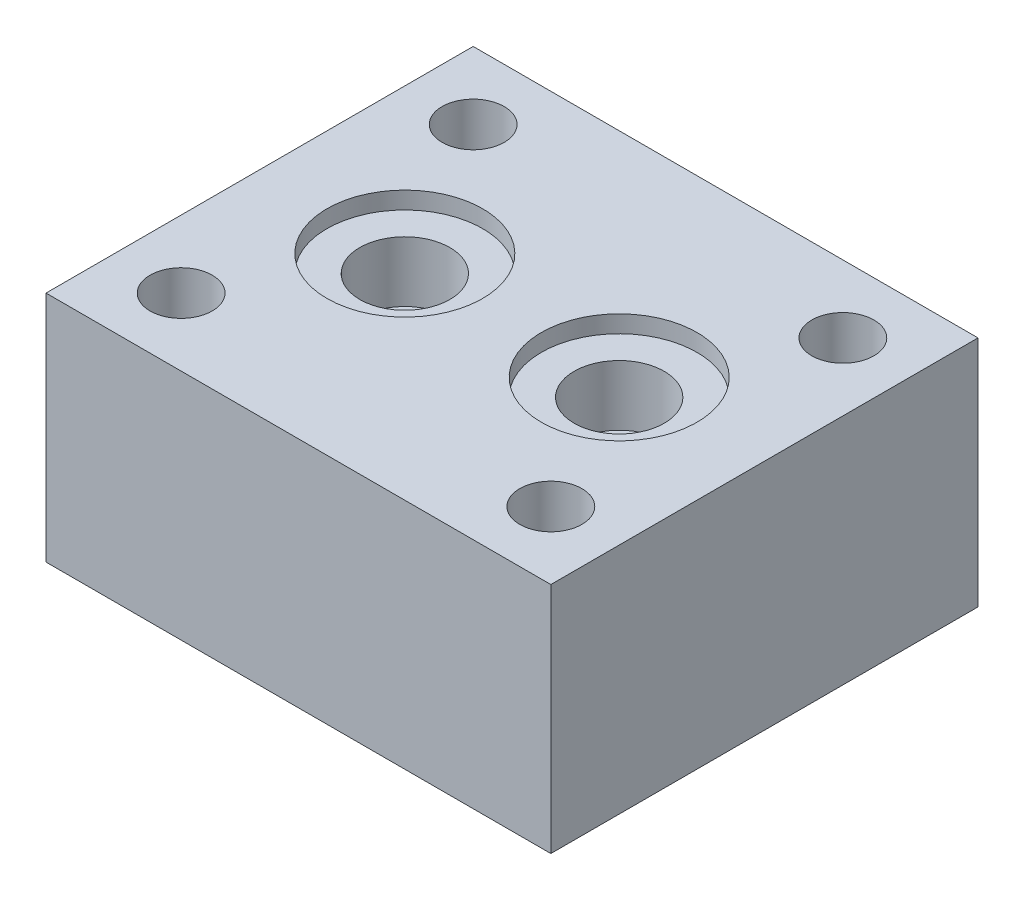
ISO-10303-21;
HEADER;
FILE_DESCRIPTION(('STEP AP214'),'2;1');
FILE_NAME('part.step','',(''),(''),'','','');
FILE_SCHEMA(('AUTOMOTIVE_DESIGN { 1 0 10303 214 1 1 1 1 }'));
ENDSEC;
DATA;
#1=APPLICATION_CONTEXT('core data for automotive mechanical design processes');
#2=APPLICATION_PROTOCOL_DEFINITION('international standard','automotive_design',2000,#1);
#3=PRODUCT_CONTEXT('',#1,'mechanical');
#4=PRODUCT('Part','Part','',(#3));
#5=PRODUCT_RELATED_PRODUCT_CATEGORY('part','',(#4));
#6=PRODUCT_DEFINITION_FORMATION('','',#4);
#7=PRODUCT_DEFINITION_CONTEXT('part definition',#1,'design');
#8=PRODUCT_DEFINITION('design','',#6,#7);
#9=PRODUCT_DEFINITION_SHAPE('','',#8);
#10=(LENGTH_UNIT() NAMED_UNIT(*) SI_UNIT(.MILLI.,.METRE.));
#11=(NAMED_UNIT(*) PLANE_ANGLE_UNIT() SI_UNIT($,.RADIAN.));
#12=(NAMED_UNIT(*) SI_UNIT($,.STERADIAN.) SOLID_ANGLE_UNIT());
#13=UNCERTAINTY_MEASURE_WITH_UNIT(LENGTH_MEASURE(1.E-05),#10,'distance_accuracy_value','');
#14=(GEOMETRIC_REPRESENTATION_CONTEXT(3) GLOBAL_UNCERTAINTY_ASSIGNED_CONTEXT((#13)) GLOBAL_UNIT_ASSIGNED_CONTEXT((#10,
#11,#12)) REPRESENTATION_CONTEXT('',''));
#15=CARTESIAN_POINT('',(0.,0.,0.));
#16=DIRECTION('',(0.,0.,1.));
#17=DIRECTION('',(1.,0.,0.));
#18=AXIS2_PLACEMENT_3D('',#15,#16,#17);
#19=CARTESIAN_POINT('',(41.275,19.05,34.925));
#20=DIRECTION('',(-1.,0.,0.));
#21=DIRECTION('',(0.,0.,1.));
#22=AXIS2_PLACEMENT_3D('',#19,#20,#21);
#23=PLANE('',#22);
#24=DIRECTION('',(0.,0.,-1.));
#25=VECTOR('',#24,1.);
#26=CARTESIAN_POINT('',(41.275,-19.05,34.925));
#27=LINE('',#26,#25);
#28=CARTESIAN_POINT('',(41.275,-19.05,34.925));
#29=VERTEX_POINT('',#28);
#30=CARTESIAN_POINT('',(41.275,-19.05,-34.925));
#31=VERTEX_POINT('',#30);
#32=EDGE_CURVE('E109',#29,#31,#27,.T.);
#33=ORIENTED_EDGE('',*,*,#32,.T.);
#34=DIRECTION('',(0.,-1.,0.));
#35=VECTOR('',#34,1.);
#36=CARTESIAN_POINT('',(41.275,19.05,-34.925));
#37=LINE('',#36,#35);
#38=CARTESIAN_POINT('',(41.275,19.05,-34.925));
#39=VERTEX_POINT('',#38);
#40=EDGE_CURVE('E11',#39,#31,#37,.T.);
#41=ORIENTED_EDGE('',*,*,#40,.F.);
#42=DIRECTION('',(0.,0.,-1.));
#43=VECTOR('',#42,1.);
#44=CARTESIAN_POINT('',(41.275,19.05,34.925));
#45=LINE('',#44,#43);
#46=CARTESIAN_POINT('',(41.275,19.05,34.925));
#47=VERTEX_POINT('',#46);
#48=EDGE_CURVE('E96',#47,#39,#45,.T.);
#49=ORIENTED_EDGE('',*,*,#48,.F.);
#50=DIRECTION('',(0.,-1.,0.));
#51=VECTOR('',#50,1.);
#52=CARTESIAN_POINT('',(41.275,19.05,34.925));
#53=LINE('',#52,#51);
#54=EDGE_CURVE('E105',#47,#29,#53,.T.);
#55=ORIENTED_EDGE('',*,*,#54,.T.);
#56=EDGE_LOOP('',(#33,#41,#49,#55));
#57=FACE_BOUND('',#56,.T.);
#58=ADVANCED_FACE('F43',(#57),#23,.F.);
#59=CARTESIAN_POINT('',(-41.275,19.05,-34.925));
#60=DIRECTION('',(0.,0.,1.));
#61=DIRECTION('',(1.,0.,0.));
#62=AXIS2_PLACEMENT_3D('',#59,#60,#61);
#63=PLANE('',#62);
#64=DIRECTION('',(-1.,0.,0.));
#65=VECTOR('',#64,1.);
#66=CARTESIAN_POINT('',(-41.275,-19.05,-34.925));
#67=LINE('',#66,#65);
#68=CARTESIAN_POINT('',(-41.275,-19.05,-34.925));
#69=VERTEX_POINT('',#68);
#70=EDGE_CURVE('E100',#31,#69,#67,.T.);
#71=ORIENTED_EDGE('',*,*,#70,.T.);
#72=DIRECTION('',(0.,-1.,0.));
#73=VECTOR('',#72,1.);
#74=CARTESIAN_POINT('',(-41.275,19.05,-34.925));
#75=LINE('',#74,#73);
#76=CARTESIAN_POINT('',(-41.275,19.05,-34.925));
#77=VERTEX_POINT('',#76);
#78=EDGE_CURVE('E52',#77,#69,#75,.T.);
#79=ORIENTED_EDGE('',*,*,#78,.F.);
#80=DIRECTION('',(-1.,0.,0.));
#81=VECTOR('',#80,1.);
#82=CARTESIAN_POINT('',(-41.275,19.05,-34.925));
#83=LINE('',#82,#81);
#84=EDGE_CURVE('E91',#39,#77,#83,.T.);
#85=ORIENTED_EDGE('',*,*,#84,.F.);
#86=ORIENTED_EDGE('',*,*,#40,.T.);
#87=EDGE_LOOP('',(#71,#79,#85,#86));
#88=FACE_BOUND('',#87,.T.);
#89=ADVANCED_FACE('F99',(#88),#63,.F.);
#90=CARTESIAN_POINT('',(-41.275,19.05,34.925));
#91=DIRECTION('',(1.,0.,0.));
#92=DIRECTION('',(0.,0.,-1.));
#93=AXIS2_PLACEMENT_3D('',#90,#91,#92);
#94=PLANE('',#93);
#95=DIRECTION('',(0.,0.,1.));
#96=VECTOR('',#95,1.);
#97=CARTESIAN_POINT('',(-41.275,-19.05,34.925));
#98=LINE('',#97,#96);
#99=CARTESIAN_POINT('',(-41.275,-19.05,34.925));
#100=VERTEX_POINT('',#99);
#101=EDGE_CURVE('E78',#69,#100,#98,.T.);
#102=ORIENTED_EDGE('',*,*,#101,.T.);
#103=DIRECTION('',(0.,-1.,0.));
#104=VECTOR('',#103,1.);
#105=CARTESIAN_POINT('',(-41.275,19.05,34.925));
#106=LINE('',#105,#104);
#107=CARTESIAN_POINT('',(-41.275,19.05,34.925));
#108=VERTEX_POINT('',#107);
#109=EDGE_CURVE('E101',#108,#100,#106,.T.);
#110=ORIENTED_EDGE('',*,*,#109,.F.);
#111=DIRECTION('',(0.,0.,1.));
#112=VECTOR('',#111,1.);
#113=CARTESIAN_POINT('',(-41.275,19.05,34.925));
#114=LINE('',#113,#112);
#115=EDGE_CURVE('E94',#77,#108,#114,.T.);
#116=ORIENTED_EDGE('',*,*,#115,.F.);
#117=ORIENTED_EDGE('',*,*,#78,.T.);
#118=EDGE_LOOP('',(#102,#110,#116,#117));
#119=FACE_BOUND('',#118,.T.);
#120=ADVANCED_FACE('F103',(#119),#94,.F.);
#121=CARTESIAN_POINT('',(-41.275,19.05,34.925));
#122=DIRECTION('',(0.,0.,-1.));
#123=DIRECTION('',(-1.,0.,0.));
#124=AXIS2_PLACEMENT_3D('',#121,#122,#123);
#125=PLANE('',#124);
#126=DIRECTION('',(1.,0.,0.));
#127=VECTOR('',#126,1.);
#128=CARTESIAN_POINT('',(-41.275,-19.05,34.925));
#129=LINE('',#128,#127);
#130=EDGE_CURVE('E84',#100,#29,#129,.T.);
#131=ORIENTED_EDGE('',*,*,#130,.T.);
#132=ORIENTED_EDGE('',*,*,#54,.F.);
#133=DIRECTION('',(1.,0.,0.));
#134=VECTOR('',#133,1.);
#135=CARTESIAN_POINT('',(-41.275,19.05,34.925));
#136=LINE('',#135,#134);
#137=EDGE_CURVE('E61',#108,#47,#136,.T.);
#138=ORIENTED_EDGE('',*,*,#137,.F.);
#139=ORIENTED_EDGE('',*,*,#109,.T.);
#140=EDGE_LOOP('',(#131,#132,#138,#139));
#141=FACE_BOUND('',#140,.T.);
#142=ADVANCED_FACE('F171',(#141),#125,.F.);
#143=CARTESIAN_POINT('',(0.,19.05,0.));
#144=DIRECTION('',(0.,-1.,0.));
#145=DIRECTION('',(0.,0.,-1.));
#146=AXIS2_PLACEMENT_3D('',#143,#144,#145);
#147=PLANE('',#146);
#148=CARTESIAN_POINT('',(-17.526,19.05,0.));
#149=DIRECTION('',(0.,1.,0.));
#150=DIRECTION('',(0.,0.,1.));
#151=AXIS2_PLACEMENT_3D('',#148,#149,#150);
#152=CIRCLE('',#151,12.7254);
#153=CARTESIAN_POINT('',(-17.526,19.05,12.7254));
#154=VERTEX_POINT('',#153);
#155=EDGE_CURVE('E125',#154,#154,#152,.T.);
#156=ORIENTED_EDGE('',*,*,#155,.F.);
#157=EDGE_LOOP('',(#156));
#158=FACE_BOUND('',#157,.T.);
#159=CARTESIAN_POINT('',(17.526,19.05,0.));
#160=DIRECTION('',(0.,1.,0.));
#161=DIRECTION('',(0.,0.,1.));
#162=AXIS2_PLACEMENT_3D('',#159,#160,#161);
#163=CIRCLE('',#162,12.7254);
#164=CARTESIAN_POINT('',(17.526,19.05,12.7254));
#165=VERTEX_POINT('',#164);
#166=EDGE_CURVE('E130',#165,#165,#163,.T.);
#167=ORIENTED_EDGE('',*,*,#166,.F.);
#168=EDGE_LOOP('',(#167));
#169=FACE_BOUND('',#168,.T.);
#170=CARTESIAN_POINT('',(30.226,19.05,23.876));
#171=DIRECTION('',(0.,1.,0.));
#172=DIRECTION('',(0.,0.,1.));
#173=AXIS2_PLACEMENT_3D('',#170,#171,#172);
#174=CIRCLE('',#173,5.08);
#175=CARTESIAN_POINT('',(30.226,19.05,28.956));
#176=VERTEX_POINT('',#175);
#177=EDGE_CURVE('E150',#176,#176,#174,.T.);
#178=ORIENTED_EDGE('',*,*,#177,.F.);
#179=EDGE_LOOP('',(#178));
#180=FACE_BOUND('',#179,.T.);
#181=CARTESIAN_POINT('',(-30.226,19.05,-23.876));
#182=DIRECTION('',(0.,1.,0.));
#183=DIRECTION('',(0.,0.,1.));
#184=AXIS2_PLACEMENT_3D('',#181,#182,#183);
#185=CIRCLE('',#184,5.08);
#186=CARTESIAN_POINT('',(-30.226,19.05,-18.796));
#187=VERTEX_POINT('',#186);
#188=EDGE_CURVE('E157',#187,#187,#185,.T.);
#189=ORIENTED_EDGE('',*,*,#188,.F.);
#190=EDGE_LOOP('',(#189));
#191=FACE_BOUND('',#190,.T.);
#192=CARTESIAN_POINT('',(30.226,19.05,-23.876));
#193=DIRECTION('',(0.,1.,0.));
#194=DIRECTION('',(0.,0.,1.));
#195=AXIS2_PLACEMENT_3D('',#192,#193,#194);
#196=CIRCLE('',#195,5.08);
#197=CARTESIAN_POINT('',(30.226,19.05,-18.796));
#198=VERTEX_POINT('',#197);
#199=EDGE_CURVE('E144',#198,#198,#196,.T.);
#200=ORIENTED_EDGE('',*,*,#199,.F.);
#201=EDGE_LOOP('',(#200));
#202=FACE_BOUND('',#201,.T.);
#203=CARTESIAN_POINT('',(-30.226,19.05,23.876));
#204=DIRECTION('',(0.,1.,0.));
#205=DIRECTION('',(0.,0.,1.));
#206=AXIS2_PLACEMENT_3D('',#203,#204,#205);
#207=CIRCLE('',#206,5.08);
#208=CARTESIAN_POINT('',(-30.226,19.05,28.956));
#209=VERTEX_POINT('',#208);
#210=EDGE_CURVE('E153',#209,#209,#207,.T.);
#211=ORIENTED_EDGE('',*,*,#210,.F.);
#212=EDGE_LOOP('',(#211));
#213=FACE_BOUND('',#212,.T.);
#214=ORIENTED_EDGE('',*,*,#48,.T.);
#215=ORIENTED_EDGE('',*,*,#84,.T.);
#216=ORIENTED_EDGE('',*,*,#115,.T.);
#217=ORIENTED_EDGE('',*,*,#137,.T.);
#218=EDGE_LOOP('',(#214,#215,#216,#217));
#219=FACE_BOUND('',#218,.T.);
#220=ADVANCED_FACE('F92',(#158,#169,#180,#191,#202,#213,#219),#147,.F.);
#221=CARTESIAN_POINT('',(0.,-19.05,0.));
#222=DIRECTION('',(0.,-1.,0.));
#223=DIRECTION('',(0.,0.,-1.));
#224=AXIS2_PLACEMENT_3D('',#221,#222,#223);
#225=PLANE('',#224);
#226=CARTESIAN_POINT('',(30.226,-19.05,23.876));
#227=DIRECTION('',(0.,1.,0.));
#228=DIRECTION('',(0.,0.,1.));
#229=AXIS2_PLACEMENT_3D('',#226,#227,#228);
#230=CIRCLE('',#229,5.08);
#231=CARTESIAN_POINT('',(30.226,-19.05,28.956));
#232=VERTEX_POINT('',#231);
#233=EDGE_CURVE('E154',#232,#232,#230,.T.);
#234=ORIENTED_EDGE('',*,*,#233,.T.);
#235=EDGE_LOOP('',(#234));
#236=FACE_BOUND('',#235,.T.);
#237=CARTESIAN_POINT('',(-30.226,-19.05,-23.876));
#238=DIRECTION('',(0.,1.,0.));
#239=DIRECTION('',(0.,0.,1.));
#240=AXIS2_PLACEMENT_3D('',#237,#238,#239);
#241=CIRCLE('',#240,5.08);
#242=CARTESIAN_POINT('',(-30.226,-19.05,-18.796));
#243=VERTEX_POINT('',#242);
#244=EDGE_CURVE('E147',#243,#243,#241,.T.);
#245=ORIENTED_EDGE('',*,*,#244,.T.);
#246=EDGE_LOOP('',(#245));
#247=FACE_BOUND('',#246,.T.);
#248=CARTESIAN_POINT('',(30.226,-19.05,-23.876));
#249=DIRECTION('',(0.,1.,0.));
#250=DIRECTION('',(0.,0.,1.));
#251=AXIS2_PLACEMENT_3D('',#248,#249,#250);
#252=CIRCLE('',#251,5.08);
#253=CARTESIAN_POINT('',(30.226,-19.05,-18.796));
#254=VERTEX_POINT('',#253);
#255=EDGE_CURVE('E141',#254,#254,#252,.T.);
#256=ORIENTED_EDGE('',*,*,#255,.T.);
#257=EDGE_LOOP('',(#256));
#258=FACE_BOUND('',#257,.T.);
#259=CARTESIAN_POINT('',(-30.226,-19.05,23.876));
#260=DIRECTION('',(0.,1.,0.));
#261=DIRECTION('',(0.,0.,1.));
#262=AXIS2_PLACEMENT_3D('',#259,#260,#261);
#263=CIRCLE('',#262,5.08);
#264=CARTESIAN_POINT('',(-30.226,-19.05,28.956));
#265=VERTEX_POINT('',#264);
#266=EDGE_CURVE('E112',#265,#265,#263,.T.);
#267=ORIENTED_EDGE('',*,*,#266,.T.);
#268=EDGE_LOOP('',(#267));
#269=FACE_BOUND('',#268,.T.);
#270=ORIENTED_EDGE('',*,*,#32,.F.);
#271=ORIENTED_EDGE('',*,*,#130,.F.);
#272=ORIENTED_EDGE('',*,*,#101,.F.);
#273=ORIENTED_EDGE('',*,*,#70,.F.);
#274=EDGE_LOOP('',(#270,#271,#272,#273));
#275=FACE_BOUND('',#274,.T.);
#276=ADVANCED_FACE('F170',(#236,#247,#258,#269,#275),#225,.T.);
#277=CARTESIAN_POINT('',(-30.226,-19.05,23.876));
#278=DIRECTION('',(0.,1.,0.));
#279=DIRECTION('',(0.,0.,1.));
#280=AXIS2_PLACEMENT_3D('',#277,#278,#279);
#281=CYLINDRICAL_SURFACE('',#280,5.08);
#282=ORIENTED_EDGE('',*,*,#266,.F.);
#283=EDGE_LOOP('',(#282));
#284=FACE_BOUND('',#283,.T.);
#285=ORIENTED_EDGE('',*,*,#210,.T.);
#286=EDGE_LOOP('',(#285));
#287=FACE_BOUND('',#286,.T.);
#288=ADVANCED_FACE('F167',(#284,#287),#281,.F.);
#289=CARTESIAN_POINT('',(30.226,-19.05,-23.876));
#290=DIRECTION('',(0.,1.,0.));
#291=DIRECTION('',(0.,0.,1.));
#292=AXIS2_PLACEMENT_3D('',#289,#290,#291);
#293=CYLINDRICAL_SURFACE('',#292,5.08);
#294=ORIENTED_EDGE('',*,*,#255,.F.);
#295=EDGE_LOOP('',(#294));
#296=FACE_BOUND('',#295,.T.);
#297=ORIENTED_EDGE('',*,*,#199,.T.);
#298=EDGE_LOOP('',(#297));
#299=FACE_BOUND('',#298,.T.);
#300=ADVANCED_FACE('F216',(#296,#299),#293,.F.);
#301=CARTESIAN_POINT('',(-30.226,-19.05,-23.876));
#302=DIRECTION('',(0.,1.,0.));
#303=DIRECTION('',(0.,0.,1.));
#304=AXIS2_PLACEMENT_3D('',#301,#302,#303);
#305=CYLINDRICAL_SURFACE('',#304,5.08);
#306=ORIENTED_EDGE('',*,*,#244,.F.);
#307=EDGE_LOOP('',(#306));
#308=FACE_BOUND('',#307,.T.);
#309=ORIENTED_EDGE('',*,*,#188,.T.);
#310=EDGE_LOOP('',(#309));
#311=FACE_BOUND('',#310,.T.);
#312=ADVANCED_FACE('F224',(#308,#311),#305,.F.);
#313=CARTESIAN_POINT('',(30.226,-19.05,23.876));
#314=DIRECTION('',(0.,1.,0.));
#315=DIRECTION('',(0.,0.,1.));
#316=AXIS2_PLACEMENT_3D('',#313,#314,#315);
#317=CYLINDRICAL_SURFACE('',#316,5.08);
#318=ORIENTED_EDGE('',*,*,#233,.F.);
#319=EDGE_LOOP('',(#318));
#320=FACE_BOUND('',#319,.T.);
#321=ORIENTED_EDGE('',*,*,#177,.T.);
#322=EDGE_LOOP('',(#321));
#323=FACE_BOUND('',#322,.T.);
#324=ADVANCED_FACE('F233',(#320,#323),#317,.F.);
#325=CARTESIAN_POINT('',(-17.526,16.2306,0.));
#326=DIRECTION('',(0.,1.,0.));
#327=DIRECTION('',(0.,0.,1.));
#328=AXIS2_PLACEMENT_3D('',#325,#326,#327);
#329=PLANE('',#328);
#330=CARTESIAN_POINT('',(-17.526,16.2306,0.));
#331=DIRECTION('',(0.,1.,0.));
#332=DIRECTION('',(0.,0.,1.));
#333=AXIS2_PLACEMENT_3D('',#330,#331,#332);
#334=CIRCLE('',#333,12.7254);
#335=CARTESIAN_POINT('',(-17.526,16.2306,12.7254));
#336=VERTEX_POINT('',#335);
#337=EDGE_CURVE('E119',#336,#336,#334,.T.);
#338=ORIENTED_EDGE('',*,*,#337,.T.);
#339=EDGE_LOOP('',(#338));
#340=FACE_BOUND('',#339,.T.);
#341=CARTESIAN_POINT('',(-17.526,16.2306,0.));
#342=DIRECTION('',(0.,1.,0.));
#343=DIRECTION('',(0.,0.,1.));
#344=AXIS2_PLACEMENT_3D('',#341,#342,#343);
#345=CIRCLE('',#344,7.366);
#346=CARTESIAN_POINT('',(-17.526,16.2306,7.366));
#347=VERTEX_POINT('',#346);
#348=EDGE_CURVE('E117',#347,#347,#345,.F.);
#349=ORIENTED_EDGE('',*,*,#348,.T.);
#350=EDGE_LOOP('',(#349));
#351=FACE_BOUND('',#350,.T.);
#352=ADVANCED_FACE('F242',(#340,#351),#329,.T.);
#353=CARTESIAN_POINT('',(-17.526,16.2306,0.));
#354=DIRECTION('',(0.,1.,0.));
#355=DIRECTION('',(0.,0.,1.));
#356=AXIS2_PLACEMENT_3D('',#353,#354,#355);
#357=CYLINDRICAL_SURFACE('',#356,12.7254);
#358=ORIENTED_EDGE('',*,*,#337,.F.);
#359=EDGE_LOOP('',(#358));
#360=FACE_BOUND('',#359,.T.);
#361=ORIENTED_EDGE('',*,*,#155,.T.);
#362=EDGE_LOOP('',(#361));
#363=FACE_BOUND('',#362,.T.);
#364=ADVANCED_FACE('F289',(#360,#363),#357,.F.);
#365=CARTESIAN_POINT('',(17.526,16.2306,0.));
#366=DIRECTION('',(0.,1.,0.));
#367=DIRECTION('',(0.,0.,1.));
#368=AXIS2_PLACEMENT_3D('',#365,#366,#367);
#369=PLANE('',#368);
#370=CARTESIAN_POINT('',(17.526,16.2306,0.));
#371=DIRECTION('',(0.,1.,0.));
#372=DIRECTION('',(0.,0.,1.));
#373=AXIS2_PLACEMENT_3D('',#370,#371,#372);
#374=CIRCLE('',#373,12.7254);
#375=CARTESIAN_POINT('',(17.526,16.2306,12.7254));
#376=VERTEX_POINT('',#375);
#377=EDGE_CURVE('E135',#376,#376,#374,.T.);
#378=ORIENTED_EDGE('',*,*,#377,.T.);
#379=EDGE_LOOP('',(#378));
#380=FACE_BOUND('',#379,.T.);
#381=CARTESIAN_POINT('',(17.526,16.2306,0.));
#382=DIRECTION('',(0.,1.,0.));
#383=DIRECTION('',(0.,0.,1.));
#384=AXIS2_PLACEMENT_3D('',#381,#382,#383);
#385=CIRCLE('',#384,7.366);
#386=CARTESIAN_POINT('',(17.526,16.2306,7.366));
#387=VERTEX_POINT('',#386);
#388=EDGE_CURVE('E46',#387,#387,#385,.F.);
#389=ORIENTED_EDGE('',*,*,#388,.T.);
#390=EDGE_LOOP('',(#389));
#391=FACE_BOUND('',#390,.T.);
#392=ADVANCED_FACE('F298',(#380,#391),#369,.T.);
#393=CARTESIAN_POINT('',(17.526,16.2306,0.));
#394=DIRECTION('',(0.,1.,0.));
#395=DIRECTION('',(0.,0.,1.));
#396=AXIS2_PLACEMENT_3D('',#393,#394,#395);
#397=CYLINDRICAL_SURFACE('',#396,12.7254);
#398=ORIENTED_EDGE('',*,*,#377,.F.);
#399=EDGE_LOOP('',(#398));
#400=FACE_BOUND('',#399,.T.);
#401=ORIENTED_EDGE('',*,*,#166,.T.);
#402=EDGE_LOOP('',(#401));
#403=FACE_BOUND('',#402,.T.);
#404=ADVANCED_FACE('F261',(#400,#403),#397,.F.);
#405=CARTESIAN_POINT('',(-17.526,6.35,0.));
#406=DIRECTION('',(0.,1.,0.));
#407=DIRECTION('',(0.,0.,1.));
#408=AXIS2_PLACEMENT_3D('',#405,#406,#407);
#409=PLANE('',#408);
#410=CARTESIAN_POINT('',(-17.526,6.35,0.));
#411=DIRECTION('',(0.,1.,0.));
#412=DIRECTION('',(0.,0.,1.));
#413=AXIS2_PLACEMENT_3D('',#410,#411,#412);
#414=CIRCLE('',#413,7.366);
#415=CARTESIAN_POINT('',(-17.526,6.35,7.366));
#416=VERTEX_POINT('',#415);
#417=EDGE_CURVE('E138',#416,#416,#414,.T.);
#418=ORIENTED_EDGE('',*,*,#417,.T.);
#419=EDGE_LOOP('',(#418));
#420=FACE_BOUND('',#419,.T.);
#421=ADVANCED_FACE('F259',(#420),#409,.T.);
#422=CARTESIAN_POINT('',(-17.526,6.35,0.));
#423=DIRECTION('',(0.,1.,0.));
#424=DIRECTION('',(0.,0.,1.));
#425=AXIS2_PLACEMENT_3D('',#422,#423,#424);
#426=CYLINDRICAL_SURFACE('',#425,7.366);
#427=ORIENTED_EDGE('',*,*,#417,.F.);
#428=EDGE_LOOP('',(#427));
#429=FACE_BOUND('',#428,.T.);
#430=ORIENTED_EDGE('',*,*,#348,.F.);
#431=EDGE_LOOP('',(#430));
#432=FACE_BOUND('',#431,.T.);
#433=ADVANCED_FACE('F252',(#429,#432),#426,.F.);
#434=CARTESIAN_POINT('',(17.526,6.35,0.));
#435=DIRECTION('',(0.,1.,0.));
#436=DIRECTION('',(0.,0.,1.));
#437=AXIS2_PLACEMENT_3D('',#434,#435,#436);
#438=PLANE('',#437);
#439=CARTESIAN_POINT('',(17.526,6.35,0.));
#440=DIRECTION('',(0.,1.,0.));
#441=DIRECTION('',(0.,0.,1.));
#442=AXIS2_PLACEMENT_3D('',#439,#440,#441);
#443=CIRCLE('',#442,7.366);
#444=CARTESIAN_POINT('',(17.526,6.35,7.366));
#445=VERTEX_POINT('',#444);
#446=EDGE_CURVE('E123',#445,#445,#443,.T.);
#447=ORIENTED_EDGE('',*,*,#446,.T.);
#448=EDGE_LOOP('',(#447));
#449=FACE_BOUND('',#448,.T.);
#450=ADVANCED_FACE('F249',(#449),#438,.T.);
#451=CARTESIAN_POINT('',(17.526,6.35,0.));
#452=DIRECTION('',(0.,1.,0.));
#453=DIRECTION('',(0.,0.,1.));
#454=AXIS2_PLACEMENT_3D('',#451,#452,#453);
#455=CYLINDRICAL_SURFACE('',#454,7.366);
#456=ORIENTED_EDGE('',*,*,#446,.F.);
#457=EDGE_LOOP('',(#456));
#458=FACE_BOUND('',#457,.T.);
#459=ORIENTED_EDGE('',*,*,#388,.F.);
#460=EDGE_LOOP('',(#459));
#461=FACE_BOUND('',#460,.T.);
#462=ADVANCED_FACE('F251',(#458,#461),#455,.F.);
#463=CLOSED_SHELL('',(#58,#89,#120,#142,#220,#276,#288,#300,#312,#324,#352,#364,#392,#404,#421,
#433,#450,#462));
#464=MANIFOLD_SOLID_BREP('B2',#463);
#465=ADVANCED_BREP_SHAPE_REPRESENTATION('',(#18,#464),#14);
#466=SHAPE_DEFINITION_REPRESENTATION(#9,#465);
ENDSEC;
END-ISO-10303-21;
